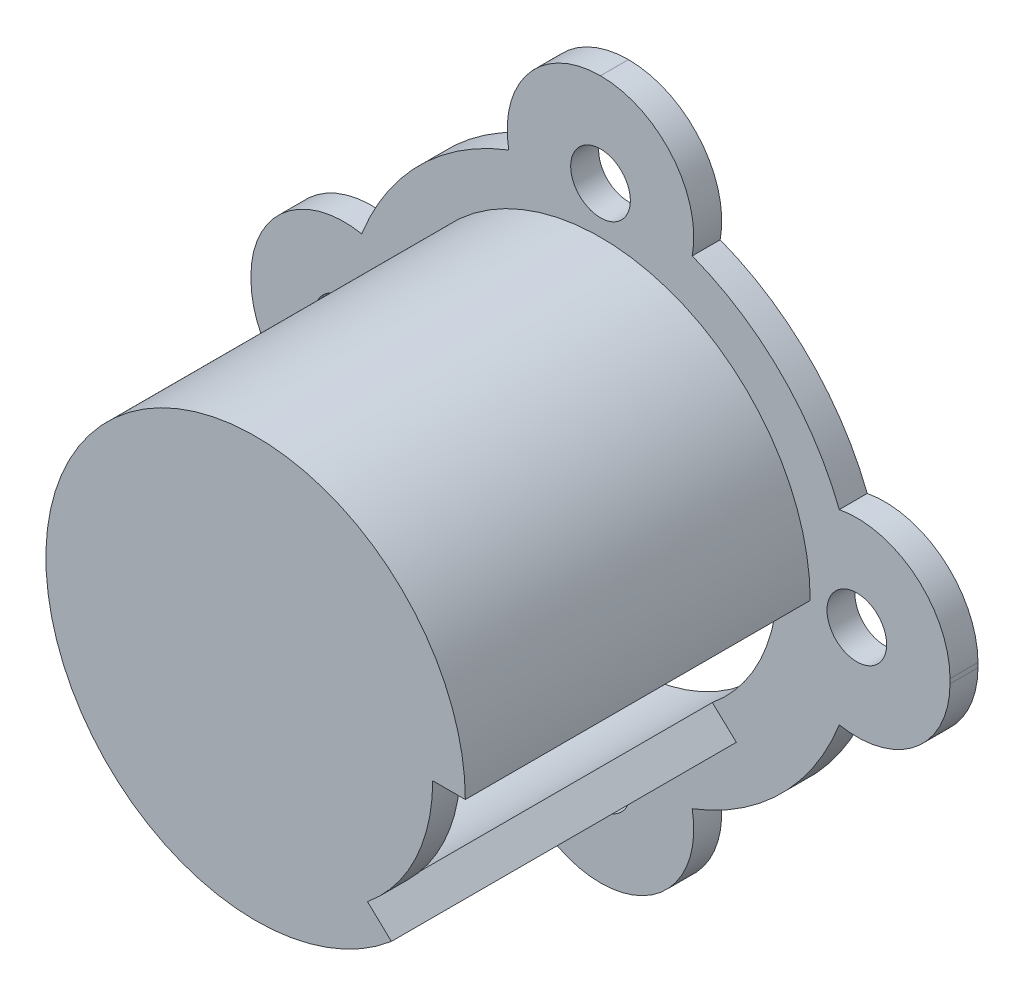
ISO-10303-21;
HEADER;
FILE_DESCRIPTION(('STEP AP214'),'2;1');
FILE_NAME('part.step','',(''),(''),'','','');
FILE_SCHEMA(('AUTOMOTIVE_DESIGN { 1 0 10303 214 1 1 1 1 }'));
ENDSEC;
DATA;
#1=APPLICATION_CONTEXT('core data for automotive mechanical design processes');
#2=APPLICATION_PROTOCOL_DEFINITION('international standard','automotive_design',2000,#1);
#3=PRODUCT_CONTEXT('',#1,'mechanical');
#4=PRODUCT('Part','Part','',(#3));
#5=PRODUCT_RELATED_PRODUCT_CATEGORY('part','',(#4));
#6=PRODUCT_DEFINITION_FORMATION('','',#4);
#7=PRODUCT_DEFINITION_CONTEXT('part definition',#1,'design');
#8=PRODUCT_DEFINITION('design','',#6,#7);
#9=PRODUCT_DEFINITION_SHAPE('','',#8);
#10=(LENGTH_UNIT() NAMED_UNIT(*) SI_UNIT(.MILLI.,.METRE.));
#11=(NAMED_UNIT(*) PLANE_ANGLE_UNIT() SI_UNIT($,.RADIAN.));
#12=(NAMED_UNIT(*) SI_UNIT($,.STERADIAN.) SOLID_ANGLE_UNIT());
#13=UNCERTAINTY_MEASURE_WITH_UNIT(LENGTH_MEASURE(1.E-05),#10,'distance_accuracy_value','');
#14=(GEOMETRIC_REPRESENTATION_CONTEXT(3) GLOBAL_UNCERTAINTY_ASSIGNED_CONTEXT((#13)) GLOBAL_UNIT_ASSIGNED_CONTEXT((#10,
#11,#12)) REPRESENTATION_CONTEXT('',''));
#15=CARTESIAN_POINT('',(0.,0.,0.));
#16=DIRECTION('',(0.,0.,1.));
#17=DIRECTION('',(1.,0.,0.));
#18=AXIS2_PLACEMENT_3D('',#15,#16,#17);
#19=CARTESIAN_POINT('',(0.,0.,-3.));
#20=DIRECTION('',(0.,0.,1.));
#21=DIRECTION('',(1.,0.,0.));
#22=AXIS2_PLACEMENT_3D('',#19,#20,#21);
#23=CYLINDRICAL_SURFACE('',#22,37.5);
#24=CARTESIAN_POINT('',(0.,0.,0.));
#25=DIRECTION('',(0.,0.,-1.));
#26=DIRECTION('',(-1.,0.,0.));
#27=AXIS2_PLACEMENT_3D('',#24,#25,#26);
#28=CIRCLE('',#27,37.5);
#29=CARTESIAN_POINT('',(37.4992082393606,0.243683034019491,0.));
#30=VERTEX_POINT('',#29);
#31=CARTESIAN_POINT('',(37.4992082393606,-0.243683034019488,0.));
#32=VERTEX_POINT('',#31);
#33=EDGE_CURVE('E278',#30,#32,#28,.T.);
#34=ORIENTED_EDGE('',*,*,#33,.T.);
#35=DIRECTION('',(0.,0.,1.));
#36=VECTOR('',#35,1.);
#37=CARTESIAN_POINT('',(37.4992082393606,-0.243683034019488,-3.));
#38=LINE('',#37,#36);
#39=CARTESIAN_POINT('',(37.4992082393606,-0.243683034019488,-3.));
#40=VERTEX_POINT('',#39);
#41=EDGE_CURVE('E11',#32,#40,#38,.F.);
#42=ORIENTED_EDGE('',*,*,#41,.T.);
#43=CARTESIAN_POINT('',(0.,0.,-3.));
#44=DIRECTION('',(0.,0.,-1.));
#45=DIRECTION('',(-1.,0.,0.));
#46=AXIS2_PLACEMENT_3D('',#43,#44,#45);
#47=CIRCLE('',#46,37.5);
#48=CARTESIAN_POINT('',(37.4992082393606,0.243683034019491,-3.));
#49=VERTEX_POINT('',#48);
#50=EDGE_CURVE('E272',#49,#40,#47,.T.);
#51=ORIENTED_EDGE('',*,*,#50,.F.);
#52=DIRECTION('',(0.,0.,1.));
#53=VECTOR('',#52,1.);
#54=CARTESIAN_POINT('',(37.4992082393606,0.243683034019491,-3.));
#55=LINE('',#54,#53);
#56=EDGE_CURVE('E341',#49,#30,#55,.T.);
#57=ORIENTED_EDGE('',*,*,#56,.T.);
#58=EDGE_LOOP('',(#34,#42,#51,#57));
#59=FACE_BOUND('',#58,.T.);
#60=ADVANCED_FACE('F35',(#59),#23,.T.);
#61=CARTESIAN_POINT('',(0.,0.,0.));
#62=DIRECTION('',(0.,0.,-1.));
#63=DIRECTION('',(-1.,0.,0.));
#64=AXIS2_PLACEMENT_3D('',#61,#62,#63);
#65=PLANE('',#64);
#66=CARTESIAN_POINT('',(0.,27.5,0.));
#67=DIRECTION('',(0.,0.,-1.));
#68=DIRECTION('',(-1.,0.,0.));
#69=AXIS2_PLACEMENT_3D('',#66,#67,#68);
#70=CIRCLE('',#69,3.2);
#71=CARTESIAN_POINT('',(-3.2,27.5,0.));
#72=VERTEX_POINT('',#71);
#73=EDGE_CURVE('E241',#72,#72,#70,.T.);
#74=ORIENTED_EDGE('',*,*,#73,.T.);
#75=EDGE_LOOP('',(#74));
#76=FACE_BOUND('',#75,.T.);
#77=CARTESIAN_POINT('',(-27.5,0.,0.));
#78=DIRECTION('',(0.,0.,-1.));
#79=DIRECTION('',(-1.,0.,0.));
#80=AXIS2_PLACEMENT_3D('',#77,#78,#79);
#81=CIRCLE('',#80,3.2);
#82=CARTESIAN_POINT('',(-30.7,0.,0.));
#83=VERTEX_POINT('',#82);
#84=EDGE_CURVE('E247',#83,#83,#81,.T.);
#85=ORIENTED_EDGE('',*,*,#84,.T.);
#86=EDGE_LOOP('',(#85));
#87=FACE_BOUND('',#86,.T.);
#88=CARTESIAN_POINT('',(0.,-27.5,0.));
#89=DIRECTION('',(0.,0.,-1.));
#90=DIRECTION('',(-1.,0.,0.));
#91=AXIS2_PLACEMENT_3D('',#88,#89,#90);
#92=CIRCLE('',#91,3.2);
#93=CARTESIAN_POINT('',(-3.2,-27.5,0.));
#94=VERTEX_POINT('',#93);
#95=EDGE_CURVE('E253',#94,#94,#92,.T.);
#96=ORIENTED_EDGE('',*,*,#95,.T.);
#97=EDGE_LOOP('',(#96));
#98=FACE_BOUND('',#97,.T.);
#99=CARTESIAN_POINT('',(27.5,0.,0.));
#100=DIRECTION('',(0.,0.,-1.));
#101=DIRECTION('',(-1.,0.,0.));
#102=AXIS2_PLACEMENT_3D('',#99,#100,#101);
#103=CIRCLE('',#102,3.2);
#104=CARTESIAN_POINT('',(24.3,0.,0.));
#105=VERTEX_POINT('',#104);
#106=EDGE_CURVE('E259',#105,#105,#103,.T.);
#107=ORIENTED_EDGE('',*,*,#106,.T.);
#108=EDGE_LOOP('',(#107));
#109=FACE_BOUND('',#108,.T.);
#110=CARTESIAN_POINT('',(0.,0.,0.));
#111=DIRECTION('',(0.,0.,-1.));
#112=DIRECTION('',(-1.,0.,0.));
#113=AXIS2_PLACEMENT_3D('',#110,#111,#112);
#114=CIRCLE('',#113,19.);
#115=CARTESIAN_POINT('',(19.,0.,0.));
#116=VERTEX_POINT('',#115);
#117=CARTESIAN_POINT('',(11.9995781260314,-14.7312635166597,0.));
#118=VERTEX_POINT('',#117);
#119=EDGE_CURVE('E262',#116,#118,#114,.T.);
#120=ORIENTED_EDGE('',*,*,#119,.T.);
#121=DIRECTION('',(-0.729810476252891,0.683649521868865,0.));
#122=VECTOR('',#121,1.);
#123=CARTESIAN_POINT('',(14.5735292742118,-17.1424106966813,0.));
#124=LINE('',#123,#122);
#125=CARTESIAN_POINT('',(14.5735292742118,-17.1424106966813,0.));
#126=VERTEX_POINT('',#125);
#127=EDGE_CURVE('E271',#126,#118,#124,.T.);
#128=ORIENTED_EDGE('',*,*,#127,.F.);
#129=CARTESIAN_POINT('',(0.,0.,0.));
#130=DIRECTION('',(0.,0.,1.));
#131=DIRECTION('',(1.,0.,0.));
#132=AXIS2_PLACEMENT_3D('',#129,#130,#131);
#133=CIRCLE('',#132,22.5);
#134=CARTESIAN_POINT('',(22.5,0.,0.));
#135=VERTEX_POINT('',#134);
#136=EDGE_CURVE('E310',#135,#126,#133,.T.);
#137=ORIENTED_EDGE('',*,*,#136,.F.);
#138=DIRECTION('',(1.,0.,0.));
#139=VECTOR('',#138,1.);
#140=CARTESIAN_POINT('',(22.5,0.,0.));
#141=LINE('',#140,#139);
#142=EDGE_CURVE('E283',#116,#135,#141,.T.);
#143=ORIENTED_EDGE('',*,*,#142,.F.);
#144=EDGE_LOOP('',(#120,#128,#137,#143));
#145=FACE_BOUND('',#144,.T.);
#146=CARTESIAN_POINT('',(0.0101629240828799,-37.4999986228663,0.));
#147=VERTEX_POINT('',#146);
#148=CARTESIAN_POINT('',(-0.0101629240828752,-37.4999986228663,0.));
#149=VERTEX_POINT('',#148);
#150=EDGE_CURVE('E183',#147,#149,#28,.T.);
#151=ORIENTED_EDGE('',*,*,#150,.F.);
#152=CARTESIAN_POINT('',(0.00745281099411195,-27.499998990102,0.));
#153=DIRECTION('',(0.,0.,-1.));
#154=DIRECTION('',(-1.,0.,0.));
#155=AXIS2_PLACEMENT_3D('',#152,#153,#154);
#156=CIRCLE('',#155,10.);
#157=CARTESIAN_POINT('',(9.84028136240149,-25.6791522973165,0.));
#158=VERTEX_POINT('',#157);
#159=EDGE_CURVE('E43',#147,#158,#156,.F.);
#160=ORIENTED_EDGE('',*,*,#159,.T.);
#161=CARTESIAN_POINT('',(0.,0.,0.));
#162=DIRECTION('',(0.,0.,1.));
#163=DIRECTION('',(1.,0.,0.));
#164=AXIS2_PLACEMENT_3D('',#161,#162,#163);
#165=CIRCLE('',#164,27.5);
#166=CARTESIAN_POINT('',(25.617376914899,-10.,0.));
#167=VERTEX_POINT('',#166);
#168=EDGE_CURVE('E181',#158,#167,#165,.T.);
#169=ORIENTED_EDGE('',*,*,#168,.T.);
#170=CARTESIAN_POINT('',(27.4994193755311,-0.178700891614291,0.));
#171=DIRECTION('',(0.,0.,-1.));
#172=DIRECTION('',(-1.,0.,0.));
#173=AXIS2_PLACEMENT_3D('',#170,#171,#172);
#174=CIRCLE('',#173,10.);
#175=EDGE_CURVE('E50',#167,#32,#174,.F.);
#176=ORIENTED_EDGE('',*,*,#175,.T.);
#177=ORIENTED_EDGE('',*,*,#33,.F.);
#178=CARTESIAN_POINT('',(27.4994193755311,0.178700891614293,0.));
#179=DIRECTION('',(0.,0.,-1.));
#180=DIRECTION('',(-1.,0.,0.));
#181=AXIS2_PLACEMENT_3D('',#178,#179,#180);
#182=CIRCLE('',#181,10.);
#183=CARTESIAN_POINT('',(25.617376914899,10.,0.));
#184=VERTEX_POINT('',#183);
#185=EDGE_CURVE('E337',#30,#184,#182,.F.);
#186=ORIENTED_EDGE('',*,*,#185,.T.);
#187=CARTESIAN_POINT('',(0.,0.,0.));
#188=DIRECTION('',(0.,0.,-1.));
#189=DIRECTION('',(1.,0.,0.));
#190=AXIS2_PLACEMENT_3D('',#187,#188,#189);
#191=CIRCLE('',#190,27.5);
#192=CARTESIAN_POINT('',(9.84028136240149,25.6791522973165,0.));
#193=VERTEX_POINT('',#192);
#194=EDGE_CURVE('E215',#193,#184,#191,.T.);
#195=ORIENTED_EDGE('',*,*,#194,.F.);
#196=CARTESIAN_POINT('',(0.00745281099410848,27.499998990102,0.));
#197=DIRECTION('',(0.,0.,-1.));
#198=DIRECTION('',(-1.,0.,0.));
#199=AXIS2_PLACEMENT_3D('',#196,#197,#198);
#200=CIRCLE('',#199,10.);
#201=CARTESIAN_POINT('',(0.0101629240828752,37.4999986228663,0.));
#202=VERTEX_POINT('',#201);
#203=EDGE_CURVE('E339',#193,#202,#200,.F.);
#204=ORIENTED_EDGE('',*,*,#203,.T.);
#205=CARTESIAN_POINT('',(-0.0101629240828799,37.4999986228663,0.));
#206=VERTEX_POINT('',#205);
#207=EDGE_CURVE('E274',#206,#202,#28,.T.);
#208=ORIENTED_EDGE('',*,*,#207,.F.);
#209=CARTESIAN_POINT('',(-0.00745281099411195,27.499998990102,0.));
#210=DIRECTION('',(0.,0.,-1.));
#211=DIRECTION('',(-1.,0.,0.));
#212=AXIS2_PLACEMENT_3D('',#209,#210,#211);
#213=CIRCLE('',#212,10.);
#214=CARTESIAN_POINT('',(-9.84028136240149,25.6791522973165,0.));
#215=VERTEX_POINT('',#214);
#216=EDGE_CURVE('E328',#206,#215,#213,.F.);
#217=ORIENTED_EDGE('',*,*,#216,.T.);
#218=CARTESIAN_POINT('',(0.,0.,0.));
#219=DIRECTION('',(0.,0.,1.));
#220=DIRECTION('',(-1.,0.,0.));
#221=AXIS2_PLACEMENT_3D('',#218,#219,#220);
#222=CIRCLE('',#221,27.5);
#223=CARTESIAN_POINT('',(-25.617376914899,10.,0.));
#224=VERTEX_POINT('',#223);
#225=EDGE_CURVE('E227',#215,#224,#222,.T.);
#226=ORIENTED_EDGE('',*,*,#225,.T.);
#227=CARTESIAN_POINT('',(-27.4994193755311,0.178700891614291,0.));
#228=DIRECTION('',(0.,0.,-1.));
#229=DIRECTION('',(-1.,0.,0.));
#230=AXIS2_PLACEMENT_3D('',#227,#228,#229);
#231=CIRCLE('',#230,10.);
#232=CARTESIAN_POINT('',(-37.4992082393606,0.243683034019488,0.));
#233=VERTEX_POINT('',#232);
#234=EDGE_CURVE('E325',#224,#233,#231,.F.);
#235=ORIENTED_EDGE('',*,*,#234,.T.);
#236=CARTESIAN_POINT('',(-37.4992082393606,-0.243683034019491,0.));
#237=VERTEX_POINT('',#236);
#238=EDGE_CURVE('E266',#237,#233,#28,.T.);
#239=ORIENTED_EDGE('',*,*,#238,.F.);
#240=CARTESIAN_POINT('',(-27.4994193755311,-0.178700891614293,0.));
#241=DIRECTION('',(0.,0.,-1.));
#242=DIRECTION('',(-1.,0.,0.));
#243=AXIS2_PLACEMENT_3D('',#240,#241,#242);
#244=CIRCLE('',#243,10.);
#245=CARTESIAN_POINT('',(-25.617376914899,-10.,0.));
#246=VERTEX_POINT('',#245);
#247=EDGE_CURVE('E350',#237,#246,#244,.F.);
#248=ORIENTED_EDGE('',*,*,#247,.T.);
#249=CARTESIAN_POINT('',(0.,0.,0.));
#250=DIRECTION('',(0.,0.,-1.));
#251=DIRECTION('',(-1.,0.,0.));
#252=AXIS2_PLACEMENT_3D('',#249,#250,#251);
#253=CIRCLE('',#252,27.5);
#254=CARTESIAN_POINT('',(-9.84028136240149,-25.6791522973165,0.));
#255=VERTEX_POINT('',#254);
#256=EDGE_CURVE('E203',#255,#246,#253,.T.);
#257=ORIENTED_EDGE('',*,*,#256,.F.);
#258=CARTESIAN_POINT('',(-0.00745281099410848,-27.499998990102,0.));
#259=DIRECTION('',(0.,0.,-1.));
#260=DIRECTION('',(-1.,0.,0.));
#261=AXIS2_PLACEMENT_3D('',#258,#259,#260);
#262=CIRCLE('',#261,10.);
#263=EDGE_CURVE('E352',#255,#149,#262,.F.);
#264=ORIENTED_EDGE('',*,*,#263,.T.);
#265=EDGE_LOOP('',(#151,#160,#169,#176,#177,#186,#195,#204,#208,#217,#226,#235,#239,#248,#257,#264));
#266=FACE_BOUND('',#265,.T.);
#267=ADVANCED_FACE('F180',(#76,#87,#98,#109,#145,#266),#65,.F.);
#268=CARTESIAN_POINT('',(0.0101629240828799,-37.4999986228663,-3.));
#269=VERTEX_POINT('',#268);
#270=CARTESIAN_POINT('',(-0.0101629240828752,-37.4999986228663,-3.));
#271=VERTEX_POINT('',#270);
#272=EDGE_CURVE('E273',#269,#271,#47,.T.);
#273=ORIENTED_EDGE('',*,*,#272,.F.);
#274=DIRECTION('',(0.,0.,1.));
#275=VECTOR('',#274,1.);
#276=CARTESIAN_POINT('',(0.0101629240828799,-37.4999986228663,-3.));
#277=LINE('',#276,#275);
#278=EDGE_CURVE('E58',#269,#147,#277,.T.);
#279=ORIENTED_EDGE('',*,*,#278,.T.);
#280=ORIENTED_EDGE('',*,*,#150,.T.);
#281=DIRECTION('',(0.,0.,1.));
#282=VECTOR('',#281,1.);
#283=CARTESIAN_POINT('',(-0.0101629240828752,-37.4999986228663,-3.));
#284=LINE('',#283,#282);
#285=EDGE_CURVE('E343',#149,#271,#284,.F.);
#286=ORIENTED_EDGE('',*,*,#285,.T.);
#287=EDGE_LOOP('',(#273,#279,#280,#286));
#288=FACE_BOUND('',#287,.T.);
#289=ADVANCED_FACE('F364',(#288),#23,.T.);
#290=CARTESIAN_POINT('',(-37.4992082393606,-0.243683034019491,-3.));
#291=VERTEX_POINT('',#290);
#292=CARTESIAN_POINT('',(-37.4992082393606,0.243683034019488,-3.));
#293=VERTEX_POINT('',#292);
#294=EDGE_CURVE('E277',#291,#293,#47,.T.);
#295=ORIENTED_EDGE('',*,*,#294,.F.);
#296=DIRECTION('',(0.,0.,1.));
#297=VECTOR('',#296,1.);
#298=CARTESIAN_POINT('',(-37.4992082393606,-0.243683034019491,-3.));
#299=LINE('',#298,#297);
#300=EDGE_CURVE('E354',#291,#237,#299,.T.);
#301=ORIENTED_EDGE('',*,*,#300,.T.);
#302=ORIENTED_EDGE('',*,*,#238,.T.);
#303=DIRECTION('',(0.,0.,1.));
#304=VECTOR('',#303,1.);
#305=CARTESIAN_POINT('',(-37.4992082393606,0.243683034019488,-3.));
#306=LINE('',#305,#304);
#307=EDGE_CURVE('E320',#233,#293,#306,.F.);
#308=ORIENTED_EDGE('',*,*,#307,.T.);
#309=EDGE_LOOP('',(#295,#301,#302,#308));
#310=FACE_BOUND('',#309,.T.);
#311=ADVANCED_FACE('F376',(#310),#23,.T.);
#312=CARTESIAN_POINT('',(0.,0.,-3.));
#313=DIRECTION('',(0.,0.,-1.));
#314=DIRECTION('',(-1.,0.,0.));
#315=AXIS2_PLACEMENT_3D('',#312,#313,#314);
#316=PLANE('',#315);
#317=CARTESIAN_POINT('',(0.,0.,-3.));
#318=DIRECTION('',(0.,0.,1.));
#319=DIRECTION('',(1.,0.,0.));
#320=AXIS2_PLACEMENT_3D('',#317,#318,#319);
#321=CIRCLE('',#320,27.5);
#322=CARTESIAN_POINT('',(9.84028136240149,-25.6791522973165,-3.));
#323=VERTEX_POINT('',#322);
#324=CARTESIAN_POINT('',(25.617376914899,-10.,-3.));
#325=VERTEX_POINT('',#324);
#326=EDGE_CURVE('E194',#323,#325,#321,.T.);
#327=ORIENTED_EDGE('',*,*,#326,.F.);
#328=CARTESIAN_POINT('',(0.00745281099411195,-27.499998990102,-3.));
#329=DIRECTION('',(0.,0.,-1.));
#330=DIRECTION('',(-1.,0.,0.));
#331=AXIS2_PLACEMENT_3D('',#328,#329,#330);
#332=CIRCLE('',#331,10.);
#333=EDGE_CURVE('E197',#323,#269,#332,.T.);
#334=ORIENTED_EDGE('',*,*,#333,.T.);
#335=ORIENTED_EDGE('',*,*,#272,.T.);
#336=CARTESIAN_POINT('',(-0.00745281099410848,-27.499998990102,-3.));
#337=DIRECTION('',(0.,0.,-1.));
#338=DIRECTION('',(-1.,0.,0.));
#339=AXIS2_PLACEMENT_3D('',#336,#337,#338);
#340=CIRCLE('',#339,10.);
#341=CARTESIAN_POINT('',(-9.84028136240149,-25.6791522973165,-3.));
#342=VERTEX_POINT('',#341);
#343=EDGE_CURVE('E348',#271,#342,#340,.T.);
#344=ORIENTED_EDGE('',*,*,#343,.T.);
#345=CARTESIAN_POINT('',(0.,0.,-3.));
#346=DIRECTION('',(0.,0.,-1.));
#347=DIRECTION('',(-1.,0.,0.));
#348=AXIS2_PLACEMENT_3D('',#345,#346,#347);
#349=CIRCLE('',#348,27.5);
#350=CARTESIAN_POINT('',(-25.617376914899,-10.,-3.));
#351=VERTEX_POINT('',#350);
#352=EDGE_CURVE('E199',#342,#351,#349,.T.);
#353=ORIENTED_EDGE('',*,*,#352,.T.);
#354=CARTESIAN_POINT('',(-27.4994193755311,-0.178700891614293,-3.));
#355=DIRECTION('',(0.,0.,-1.));
#356=DIRECTION('',(-1.,0.,0.));
#357=AXIS2_PLACEMENT_3D('',#354,#355,#356);
#358=CIRCLE('',#357,10.);
#359=EDGE_CURVE('E346',#351,#291,#358,.T.);
#360=ORIENTED_EDGE('',*,*,#359,.T.);
#361=ORIENTED_EDGE('',*,*,#294,.T.);
#362=CARTESIAN_POINT('',(-27.4994193755311,0.178700891614291,-3.));
#363=DIRECTION('',(0.,0.,-1.));
#364=DIRECTION('',(-1.,0.,0.));
#365=AXIS2_PLACEMENT_3D('',#362,#363,#364);
#366=CIRCLE('',#365,10.);
#367=CARTESIAN_POINT('',(-25.617376914899,10.,-3.));
#368=VERTEX_POINT('',#367);
#369=EDGE_CURVE('E314',#293,#368,#366,.T.);
#370=ORIENTED_EDGE('',*,*,#369,.T.);
#371=CARTESIAN_POINT('',(0.,0.,-3.));
#372=DIRECTION('',(0.,0.,1.));
#373=DIRECTION('',(-1.,0.,0.));
#374=AXIS2_PLACEMENT_3D('',#371,#372,#373);
#375=CIRCLE('',#374,27.5);
#376=CARTESIAN_POINT('',(-9.84028136240149,25.6791522973165,-3.));
#377=VERTEX_POINT('',#376);
#378=EDGE_CURVE('E224',#377,#368,#375,.T.);
#379=ORIENTED_EDGE('',*,*,#378,.F.);
#380=CARTESIAN_POINT('',(-0.00745281099411195,27.499998990102,-3.));
#381=DIRECTION('',(0.,0.,-1.));
#382=DIRECTION('',(-1.,0.,0.));
#383=AXIS2_PLACEMENT_3D('',#380,#381,#382);
#384=CIRCLE('',#383,10.);
#385=CARTESIAN_POINT('',(-0.0101629240828799,37.4999986228663,-3.));
#386=VERTEX_POINT('',#385);
#387=EDGE_CURVE('E318',#377,#386,#384,.T.);
#388=ORIENTED_EDGE('',*,*,#387,.T.);
#389=CARTESIAN_POINT('',(0.0101629240828752,37.4999986228663,-3.));
#390=VERTEX_POINT('',#389);
#391=EDGE_CURVE('E268',#386,#390,#47,.T.);
#392=ORIENTED_EDGE('',*,*,#391,.T.);
#393=CARTESIAN_POINT('',(0.00745281099410848,27.499998990102,-3.));
#394=DIRECTION('',(0.,0.,-1.));
#395=DIRECTION('',(-1.,0.,0.));
#396=AXIS2_PLACEMENT_3D('',#393,#394,#395);
#397=CIRCLE('',#396,10.);
#398=CARTESIAN_POINT('',(9.84028136240149,25.6791522973165,-3.));
#399=VERTEX_POINT('',#398);
#400=EDGE_CURVE('E335',#390,#399,#397,.T.);
#401=ORIENTED_EDGE('',*,*,#400,.T.);
#402=CARTESIAN_POINT('',(0.,0.,-3.));
#403=DIRECTION('',(0.,0.,-1.));
#404=DIRECTION('',(1.,0.,0.));
#405=AXIS2_PLACEMENT_3D('',#402,#403,#404);
#406=CIRCLE('',#405,27.5);
#407=CARTESIAN_POINT('',(25.617376914899,10.,-3.));
#408=VERTEX_POINT('',#407);
#409=EDGE_CURVE('E212',#399,#408,#406,.T.);
#410=ORIENTED_EDGE('',*,*,#409,.T.);
#411=CARTESIAN_POINT('',(27.4994193755311,0.178700891614293,-3.));
#412=DIRECTION('',(0.,0.,-1.));
#413=DIRECTION('',(-1.,0.,0.));
#414=AXIS2_PLACEMENT_3D('',#411,#412,#413);
#415=CIRCLE('',#414,10.);
#416=EDGE_CURVE('E333',#408,#49,#415,.T.);
#417=ORIENTED_EDGE('',*,*,#416,.T.);
#418=ORIENTED_EDGE('',*,*,#50,.T.);
#419=CARTESIAN_POINT('',(27.4994193755311,-0.178700891614291,-3.));
#420=DIRECTION('',(0.,0.,-1.));
#421=DIRECTION('',(-1.,0.,0.));
#422=AXIS2_PLACEMENT_3D('',#419,#420,#421);
#423=CIRCLE('',#422,10.);
#424=EDGE_CURVE('E356',#40,#325,#423,.T.);
#425=ORIENTED_EDGE('',*,*,#424,.T.);
#426=EDGE_LOOP('',(#327,#334,#335,#344,#353,#360,#361,#370,#379,#388,#392,#401,#410,#417,#418,#425));
#427=FACE_BOUND('',#426,.T.);
#428=CARTESIAN_POINT('',(0.,27.5,-3.));
#429=DIRECTION('',(0.,0.,-1.));
#430=DIRECTION('',(-1.,0.,0.));
#431=AXIS2_PLACEMENT_3D('',#428,#429,#430);
#432=CIRCLE('',#431,3.2);
#433=CARTESIAN_POINT('',(-3.2,27.5,-3.));
#434=VERTEX_POINT('',#433);
#435=EDGE_CURVE('E236',#434,#434,#432,.T.);
#436=ORIENTED_EDGE('',*,*,#435,.F.);
#437=EDGE_LOOP('',(#436));
#438=FACE_BOUND('',#437,.T.);
#439=CARTESIAN_POINT('',(-27.5,0.,-3.));
#440=DIRECTION('',(0.,0.,-1.));
#441=DIRECTION('',(-1.,0.,0.));
#442=AXIS2_PLACEMENT_3D('',#439,#440,#441);
#443=CIRCLE('',#442,3.2);
#444=CARTESIAN_POINT('',(-30.7,0.,-3.));
#445=VERTEX_POINT('',#444);
#446=EDGE_CURVE('E244',#445,#445,#443,.T.);
#447=ORIENTED_EDGE('',*,*,#446,.F.);
#448=EDGE_LOOP('',(#447));
#449=FACE_BOUND('',#448,.T.);
#450=CARTESIAN_POINT('',(0.,-27.5,-3.));
#451=DIRECTION('',(0.,0.,-1.));
#452=DIRECTION('',(-1.,0.,0.));
#453=AXIS2_PLACEMENT_3D('',#450,#451,#452);
#454=CIRCLE('',#453,3.2);
#455=CARTESIAN_POINT('',(-3.2,-27.5,-3.));
#456=VERTEX_POINT('',#455);
#457=EDGE_CURVE('E250',#456,#456,#454,.T.);
#458=ORIENTED_EDGE('',*,*,#457,.F.);
#459=EDGE_LOOP('',(#458));
#460=FACE_BOUND('',#459,.T.);
#461=CARTESIAN_POINT('',(27.5,0.,-3.));
#462=DIRECTION('',(0.,0.,-1.));
#463=DIRECTION('',(-1.,0.,0.));
#464=AXIS2_PLACEMENT_3D('',#461,#462,#463);
#465=CIRCLE('',#464,3.2);
#466=CARTESIAN_POINT('',(24.3,0.,-3.));
#467=VERTEX_POINT('',#466);
#468=EDGE_CURVE('E256',#467,#467,#465,.T.);
#469=ORIENTED_EDGE('',*,*,#468,.F.);
#470=EDGE_LOOP('',(#469));
#471=FACE_BOUND('',#470,.T.);
#472=CARTESIAN_POINT('',(0.,0.,-3.));
#473=DIRECTION('',(0.,0.,-1.));
#474=DIRECTION('',(-1.,0.,0.));
#475=AXIS2_PLACEMENT_3D('',#472,#473,#474);
#476=CIRCLE('',#475,19.);
#477=CARTESIAN_POINT('',(-19.,0.,-3.));
#478=VERTEX_POINT('',#477);
#479=EDGE_CURVE('E263',#478,#478,#476,.T.);
#480=ORIENTED_EDGE('',*,*,#479,.F.);
#481=EDGE_LOOP('',(#480));
#482=FACE_BOUND('',#481,.T.);
#483=ADVANCED_FACE('F361',(#427,#438,#449,#460,#471,#482),#316,.T.);
#484=ORIENTED_EDGE('',*,*,#207,.T.);
#485=DIRECTION('',(0.,0.,1.));
#486=VECTOR('',#485,1.);
#487=CARTESIAN_POINT('',(0.0101629240828752,37.4999986228663,-3.));
#488=LINE('',#487,#486);
#489=EDGE_CURVE('E330',#202,#390,#488,.F.);
#490=ORIENTED_EDGE('',*,*,#489,.T.);
#491=ORIENTED_EDGE('',*,*,#391,.F.);
#492=DIRECTION('',(0.,0.,1.));
#493=VECTOR('',#492,1.);
#494=CARTESIAN_POINT('',(-0.0101629240828799,37.4999986228663,-3.));
#495=LINE('',#494,#493);
#496=EDGE_CURVE('E323',#386,#206,#495,.T.);
#497=ORIENTED_EDGE('',*,*,#496,.T.);
#498=EDGE_LOOP('',(#484,#490,#491,#497));
#499=FACE_BOUND('',#498,.T.);
#500=ADVANCED_FACE('F390',(#499),#23,.T.);
#501=CARTESIAN_POINT('',(0.,0.,37.));
#502=DIRECTION('',(0.,0.,-1.));
#503=DIRECTION('',(-1.,0.,0.));
#504=AXIS2_PLACEMENT_3D('',#501,#502,#503);
#505=CYLINDRICAL_SURFACE('',#504,22.5);
#506=CARTESIAN_POINT('',(0.,0.,37.));
#507=DIRECTION('',(0.,0.,1.));
#508=DIRECTION('',(1.,0.,0.));
#509=AXIS2_PLACEMENT_3D('',#506,#507,#508);
#510=CIRCLE('',#509,22.5);
#511=CARTESIAN_POINT('',(22.5,0.,37.));
#512=VERTEX_POINT('',#511);
#513=CARTESIAN_POINT('',(14.5735292742118,-17.1424106966813,37.));
#514=VERTEX_POINT('',#513);
#515=EDGE_CURVE('E311',#512,#514,#510,.T.);
#516=ORIENTED_EDGE('',*,*,#515,.F.);
#517=DIRECTION('',(0.,0.,-1.));
#518=VECTOR('',#517,1.);
#519=CARTESIAN_POINT('',(22.5,0.,37.));
#520=LINE('',#519,#518);
#521=EDGE_CURVE('E294',#512,#135,#520,.T.);
#522=ORIENTED_EDGE('',*,*,#521,.T.);
#523=ORIENTED_EDGE('',*,*,#136,.T.);
#524=DIRECTION('',(0.,0.,-1.));
#525=VECTOR('',#524,1.);
#526=CARTESIAN_POINT('',(14.5735292742118,-17.1424106966813,37.));
#527=LINE('',#526,#525);
#528=EDGE_CURVE('E289',#514,#126,#527,.T.);
#529=ORIENTED_EDGE('',*,*,#528,.F.);
#530=EDGE_LOOP('',(#516,#522,#523,#529));
#531=FACE_BOUND('',#530,.T.);
#532=ADVANCED_FACE('F422',(#531),#505,.T.);
#533=CARTESIAN_POINT('',(0.,0.,37.));
#534=DIRECTION('',(0.,0.,1.));
#535=DIRECTION('',(1.,0.,0.));
#536=AXIS2_PLACEMENT_3D('',#533,#534,#535);
#537=PLANE('',#536);
#538=DIRECTION('',(1.,0.,0.));
#539=VECTOR('',#538,1.);
#540=CARTESIAN_POINT('',(22.5,0.,37.));
#541=LINE('',#540,#539);
#542=CARTESIAN_POINT('',(19.,0.,37.));
#543=VERTEX_POINT('',#542);
#544=EDGE_CURVE('E286',#543,#512,#541,.T.);
#545=ORIENTED_EDGE('',*,*,#544,.T.);
#546=ORIENTED_EDGE('',*,*,#515,.T.);
#547=DIRECTION('',(-0.729810476252891,0.683649521868865,0.));
#548=VECTOR('',#547,1.);
#549=CARTESIAN_POINT('',(14.5735292742118,-17.1424106966813,37.));
#550=LINE('',#549,#548);
#551=CARTESIAN_POINT('',(11.9995781260314,-14.7312635166597,37.));
#552=VERTEX_POINT('',#551);
#553=EDGE_CURVE('E279',#514,#552,#550,.T.);
#554=ORIENTED_EDGE('',*,*,#553,.T.);
#555=CARTESIAN_POINT('',(0.,0.,37.));
#556=DIRECTION('',(0.,0.,1.));
#557=DIRECTION('',(1.,0.,0.));
#558=AXIS2_PLACEMENT_3D('',#555,#556,#557);
#559=CIRCLE('',#558,19.);
#560=EDGE_CURVE('E282',#552,#543,#559,.T.);
#561=ORIENTED_EDGE('',*,*,#560,.T.);
#562=EDGE_LOOP('',(#545,#546,#554,#561));
#563=FACE_BOUND('',#562,.T.);
#564=ADVANCED_FACE('F427',(#563),#537,.T.);
#565=CARTESIAN_POINT('',(0.,0.,-3.));
#566=DIRECTION('',(0.,0.,1.));
#567=DIRECTION('',(1.,0.,0.));
#568=AXIS2_PLACEMENT_3D('',#565,#566,#567);
#569=CYLINDRICAL_SURFACE('',#568,19.);
#570=DIRECTION('',(0.,0.,-1.));
#571=VECTOR('',#570,1.);
#572=CARTESIAN_POINT('',(19.,0.,37.));
#573=LINE('',#572,#571);
#574=CARTESIAN_POINT('',(19.,0.,34.));
#575=VERTEX_POINT('',#574);
#576=EDGE_CURVE('E301',#575,#116,#573,.T.);
#577=ORIENTED_EDGE('',*,*,#576,.F.);
#578=CARTESIAN_POINT('',(0.,0.,34.));
#579=DIRECTION('',(0.,0.,-1.));
#580=DIRECTION('',(-1.,0.,0.));
#581=AXIS2_PLACEMENT_3D('',#578,#579,#580);
#582=CIRCLE('',#581,19.);
#583=CARTESIAN_POINT('',(11.9995781260314,-14.7312635166597,34.));
#584=VERTEX_POINT('',#583);
#585=EDGE_CURVE('E297',#584,#575,#582,.T.);
#586=ORIENTED_EDGE('',*,*,#585,.F.);
#587=DIRECTION('',(0.,0.,-1.));
#588=VECTOR('',#587,1.);
#589=CARTESIAN_POINT('',(11.9995781260314,-14.7312635166597,37.));
#590=LINE('',#589,#588);
#591=EDGE_CURVE('E304',#584,#118,#590,.T.);
#592=ORIENTED_EDGE('',*,*,#591,.T.);
#593=ORIENTED_EDGE('',*,*,#119,.F.);
#594=EDGE_LOOP('',(#577,#586,#592,#593));
#595=FACE_BOUND('',#594,.T.);
#596=ORIENTED_EDGE('',*,*,#479,.T.);
#597=EDGE_LOOP('',(#596));
#598=FACE_BOUND('',#597,.T.);
#599=ADVANCED_FACE('F627',(#595,#598),#569,.F.);
#600=CARTESIAN_POINT('',(0.,0.,34.));
#601=DIRECTION('',(0.,0.,-1.));
#602=DIRECTION('',(-1.,0.,0.));
#603=AXIS2_PLACEMENT_3D('',#600,#601,#602);
#604=PLANE('',#603);
#605=EDGE_CURVE('E307',#575,#584,#582,.T.);
#606=ORIENTED_EDGE('',*,*,#605,.T.);
#607=ORIENTED_EDGE('',*,*,#585,.T.);
#608=EDGE_LOOP('',(#606,#607));
#609=FACE_BOUND('',#608,.T.);
#610=ADVANCED_FACE('F620',(#609),#604,.T.);
#611=CARTESIAN_POINT('',(22.5,0.,37.));
#612=DIRECTION('',(0.,1.,0.));
#613=DIRECTION('',(0.,0.,1.));
#614=AXIS2_PLACEMENT_3D('',#611,#612,#613);
#615=PLANE('',#614);
#616=ORIENTED_EDGE('',*,*,#142,.T.);
#617=ORIENTED_EDGE('',*,*,#521,.F.);
#618=ORIENTED_EDGE('',*,*,#544,.F.);
#619=EDGE_CURVE('E298',#543,#575,#573,.T.);
#620=ORIENTED_EDGE('',*,*,#619,.T.);
#621=ORIENTED_EDGE('',*,*,#576,.T.);
#622=EDGE_LOOP('',(#616,#617,#618,#620,#621));
#623=FACE_BOUND('',#622,.T.);
#624=ADVANCED_FACE('F615',(#623),#615,.F.);
#625=CARTESIAN_POINT('',(0.,0.,37.));
#626=DIRECTION('',(0.,0.,-1.));
#627=DIRECTION('',(-1.,0.,0.));
#628=AXIS2_PLACEMENT_3D('',#625,#626,#627);
#629=CYLINDRICAL_SURFACE('',#628,19.);
#630=ORIENTED_EDGE('',*,*,#605,.F.);
#631=ORIENTED_EDGE('',*,*,#619,.F.);
#632=ORIENTED_EDGE('',*,*,#560,.F.);
#633=EDGE_CURVE('E302',#552,#584,#590,.T.);
#634=ORIENTED_EDGE('',*,*,#633,.T.);
#635=EDGE_LOOP('',(#630,#631,#632,#634));
#636=FACE_BOUND('',#635,.T.);
#637=ADVANCED_FACE('F607',(#636),#629,.T.);
#638=CARTESIAN_POINT('',(14.5735292742118,-17.1424106966813,37.));
#639=DIRECTION('',(-0.683649521868865,-0.729810476252891,0.));
#640=DIRECTION('',(0.729810476252891,-0.683649521868865,0.));
#641=AXIS2_PLACEMENT_3D('',#638,#639,#640);
#642=PLANE('',#641);
#643=ORIENTED_EDGE('',*,*,#127,.T.);
#644=ORIENTED_EDGE('',*,*,#591,.F.);
#645=ORIENTED_EDGE('',*,*,#633,.F.);
#646=ORIENTED_EDGE('',*,*,#553,.F.);
#647=ORIENTED_EDGE('',*,*,#528,.T.);
#648=EDGE_LOOP('',(#643,#644,#645,#646,#647));
#649=FACE_BOUND('',#648,.T.);
#650=ADVANCED_FACE('F596',(#649),#642,.F.);
#651=CARTESIAN_POINT('',(27.5,0.,-3.));
#652=DIRECTION('',(0.,0.,-1.));
#653=DIRECTION('',(-1.,0.,0.));
#654=AXIS2_PLACEMENT_3D('',#651,#652,#653);
#655=CYLINDRICAL_SURFACE('',#654,3.2);
#656=ORIENTED_EDGE('',*,*,#106,.F.);
#657=EDGE_LOOP('',(#656));
#658=FACE_BOUND('',#657,.T.);
#659=ORIENTED_EDGE('',*,*,#468,.T.);
#660=EDGE_LOOP('',(#659));
#661=FACE_BOUND('',#660,.T.);
#662=ADVANCED_FACE('F586',(#658,#661),#655,.F.);
#663=CARTESIAN_POINT('',(0.,-27.5,-3.));
#664=DIRECTION('',(0.,0.,-1.));
#665=DIRECTION('',(-1.,0.,0.));
#666=AXIS2_PLACEMENT_3D('',#663,#664,#665);
#667=CYLINDRICAL_SURFACE('',#666,3.2);
#668=ORIENTED_EDGE('',*,*,#95,.F.);
#669=EDGE_LOOP('',(#668));
#670=FACE_BOUND('',#669,.T.);
#671=ORIENTED_EDGE('',*,*,#457,.T.);
#672=EDGE_LOOP('',(#671));
#673=FACE_BOUND('',#672,.T.);
#674=ADVANCED_FACE('F576',(#670,#673),#667,.F.);
#675=CARTESIAN_POINT('',(-27.5,0.,-3.));
#676=DIRECTION('',(0.,0.,-1.));
#677=DIRECTION('',(-1.,0.,0.));
#678=AXIS2_PLACEMENT_3D('',#675,#676,#677);
#679=CYLINDRICAL_SURFACE('',#678,3.2);
#680=ORIENTED_EDGE('',*,*,#84,.F.);
#681=EDGE_LOOP('',(#680));
#682=FACE_BOUND('',#681,.T.);
#683=ORIENTED_EDGE('',*,*,#446,.T.);
#684=EDGE_LOOP('',(#683));
#685=FACE_BOUND('',#684,.T.);
#686=ADVANCED_FACE('F566',(#682,#685),#679,.F.);
#687=CARTESIAN_POINT('',(0.,27.5,-3.));
#688=DIRECTION('',(0.,0.,-1.));
#689=DIRECTION('',(-1.,0.,0.));
#690=AXIS2_PLACEMENT_3D('',#687,#688,#689);
#691=CYLINDRICAL_SURFACE('',#690,3.2);
#692=ORIENTED_EDGE('',*,*,#73,.F.);
#693=EDGE_LOOP('',(#692));
#694=FACE_BOUND('',#693,.T.);
#695=ORIENTED_EDGE('',*,*,#435,.T.);
#696=EDGE_LOOP('',(#695));
#697=FACE_BOUND('',#696,.T.);
#698=ADVANCED_FACE('F557',(#694,#697),#691,.F.);
#699=CARTESIAN_POINT('',(0.,0.,0.));
#700=DIRECTION('',(0.,0.,-1.));
#701=DIRECTION('',(-1.,0.,0.));
#702=AXIS2_PLACEMENT_3D('',#699,#700,#701);
#703=CYLINDRICAL_SURFACE('',#702,27.5);
#704=ORIENTED_EDGE('',*,*,#378,.T.);
#705=DIRECTION('',(0.,0.,-1.));
#706=VECTOR('',#705,1.);
#707=CARTESIAN_POINT('',(-25.617376914899,10.,0.));
#708=LINE('',#707,#706);
#709=EDGE_CURVE('E233',#224,#368,#708,.T.);
#710=ORIENTED_EDGE('',*,*,#709,.F.);
#711=ORIENTED_EDGE('',*,*,#225,.F.);
#712=DIRECTION('',(0.,0.,-1.));
#713=VECTOR('',#712,1.);
#714=CARTESIAN_POINT('',(-9.84028136240149,25.6791522973165,0.));
#715=LINE('',#714,#713);
#716=EDGE_CURVE('E230',#215,#377,#715,.T.);
#717=ORIENTED_EDGE('',*,*,#716,.T.);
#718=EDGE_LOOP('',(#704,#710,#711,#717));
#719=FACE_BOUND('',#718,.T.);
#720=ADVANCED_FACE('F384',(#719),#703,.T.);
#721=CARTESIAN_POINT('',(-0.00745281099411195,27.499998990102,-3.));
#722=DIRECTION('',(0.,0.,1.));
#723=DIRECTION('',(1.,0.,0.));
#724=AXIS2_PLACEMENT_3D('',#721,#722,#723);
#725=CYLINDRICAL_SURFACE('',#724,10.);
#726=ORIENTED_EDGE('',*,*,#216,.F.);
#727=ORIENTED_EDGE('',*,*,#496,.F.);
#728=ORIENTED_EDGE('',*,*,#387,.F.);
#729=ORIENTED_EDGE('',*,*,#716,.F.);
#730=EDGE_LOOP('',(#726,#727,#728,#729));
#731=FACE_BOUND('',#730,.T.);
#732=ADVANCED_FACE('F386',(#731),#725,.T.);
#733=CARTESIAN_POINT('',(-27.4994193755311,0.178700891614291,0.));
#734=DIRECTION('',(0.,0.,1.));
#735=DIRECTION('',(1.,0.,0.));
#736=AXIS2_PLACEMENT_3D('',#733,#734,#735);
#737=CYLINDRICAL_SURFACE('',#736,10.);
#738=ORIENTED_EDGE('',*,*,#234,.F.);
#739=ORIENTED_EDGE('',*,*,#709,.T.);
#740=ORIENTED_EDGE('',*,*,#369,.F.);
#741=ORIENTED_EDGE('',*,*,#307,.F.);
#742=EDGE_LOOP('',(#738,#739,#740,#741));
#743=FACE_BOUND('',#742,.T.);
#744=ADVANCED_FACE('F375',(#743),#737,.T.);
#745=CARTESIAN_POINT('',(0.,0.,0.));
#746=DIRECTION('',(0.,0.,-1.));
#747=DIRECTION('',(-1.,0.,0.));
#748=AXIS2_PLACEMENT_3D('',#745,#746,#747);
#749=CYLINDRICAL_SURFACE('',#748,27.5);
#750=ORIENTED_EDGE('',*,*,#409,.F.);
#751=DIRECTION('',(0.,0.,-1.));
#752=VECTOR('',#751,1.);
#753=CARTESIAN_POINT('',(9.84028136240149,25.6791522973165,0.));
#754=LINE('',#753,#752);
#755=EDGE_CURVE('E221',#193,#399,#754,.T.);
#756=ORIENTED_EDGE('',*,*,#755,.F.);
#757=ORIENTED_EDGE('',*,*,#194,.T.);
#758=DIRECTION('',(0.,0.,-1.));
#759=VECTOR('',#758,1.);
#760=CARTESIAN_POINT('',(25.617376914899,10.,0.));
#761=LINE('',#760,#759);
#762=EDGE_CURVE('E218',#184,#408,#761,.T.);
#763=ORIENTED_EDGE('',*,*,#762,.T.);
#764=EDGE_LOOP('',(#750,#756,#757,#763));
#765=FACE_BOUND('',#764,.T.);
#766=ADVANCED_FACE('F397',(#765),#749,.T.);
#767=CARTESIAN_POINT('',(0.00745281099410848,27.499998990102,0.));
#768=DIRECTION('',(0.,0.,1.));
#769=DIRECTION('',(1.,0.,0.));
#770=AXIS2_PLACEMENT_3D('',#767,#768,#769);
#771=CYLINDRICAL_SURFACE('',#770,10.);
#772=ORIENTED_EDGE('',*,*,#203,.F.);
#773=ORIENTED_EDGE('',*,*,#755,.T.);
#774=ORIENTED_EDGE('',*,*,#400,.F.);
#775=ORIENTED_EDGE('',*,*,#489,.F.);
#776=EDGE_LOOP('',(#772,#773,#774,#775));
#777=FACE_BOUND('',#776,.T.);
#778=ADVANCED_FACE('F394',(#777),#771,.T.);
#779=CARTESIAN_POINT('',(27.4994193755311,0.178700891614293,-3.));
#780=DIRECTION('',(0.,0.,1.));
#781=DIRECTION('',(1.,0.,0.));
#782=AXIS2_PLACEMENT_3D('',#779,#780,#781);
#783=CYLINDRICAL_SURFACE('',#782,10.);
#784=ORIENTED_EDGE('',*,*,#185,.F.);
#785=ORIENTED_EDGE('',*,*,#56,.F.);
#786=ORIENTED_EDGE('',*,*,#416,.F.);
#787=ORIENTED_EDGE('',*,*,#762,.F.);
#788=EDGE_LOOP('',(#784,#785,#786,#787));
#789=FACE_BOUND('',#788,.T.);
#790=ADVANCED_FACE('F402',(#789),#783,.T.);
#791=CARTESIAN_POINT('',(0.,0.,0.));
#792=DIRECTION('',(0.,0.,-1.));
#793=DIRECTION('',(-1.,0.,0.));
#794=AXIS2_PLACEMENT_3D('',#791,#792,#793);
#795=CYLINDRICAL_SURFACE('',#794,27.5);
#796=ORIENTED_EDGE('',*,*,#352,.F.);
#797=DIRECTION('',(0.,0.,-1.));
#798=VECTOR('',#797,1.);
#799=CARTESIAN_POINT('',(-9.84028136240149,-25.6791522973165,0.));
#800=LINE('',#799,#798);
#801=EDGE_CURVE('E209',#255,#342,#800,.T.);
#802=ORIENTED_EDGE('',*,*,#801,.F.);
#803=ORIENTED_EDGE('',*,*,#256,.T.);
#804=DIRECTION('',(0.,0.,-1.));
#805=VECTOR('',#804,1.);
#806=CARTESIAN_POINT('',(-25.617376914899,-10.,0.));
#807=LINE('',#806,#805);
#808=EDGE_CURVE('E206',#246,#351,#807,.T.);
#809=ORIENTED_EDGE('',*,*,#808,.T.);
#810=EDGE_LOOP('',(#796,#802,#803,#809));
#811=FACE_BOUND('',#810,.T.);
#812=ADVANCED_FACE('F446',(#811),#795,.T.);
#813=CARTESIAN_POINT('',(-0.00745281099410848,-27.499998990102,0.));
#814=DIRECTION('',(0.,0.,1.));
#815=DIRECTION('',(1.,0.,0.));
#816=AXIS2_PLACEMENT_3D('',#813,#814,#815);
#817=CYLINDRICAL_SURFACE('',#816,10.);
#818=ORIENTED_EDGE('',*,*,#263,.F.);
#819=ORIENTED_EDGE('',*,*,#801,.T.);
#820=ORIENTED_EDGE('',*,*,#343,.F.);
#821=ORIENTED_EDGE('',*,*,#285,.F.);
#822=EDGE_LOOP('',(#818,#819,#820,#821));
#823=FACE_BOUND('',#822,.T.);
#824=ADVANCED_FACE('F451',(#823),#817,.T.);
#825=CARTESIAN_POINT('',(-27.4994193755311,-0.178700891614293,-3.));
#826=DIRECTION('',(0.,0.,1.));
#827=DIRECTION('',(1.,0.,0.));
#828=AXIS2_PLACEMENT_3D('',#825,#826,#827);
#829=CYLINDRICAL_SURFACE('',#828,10.);
#830=ORIENTED_EDGE('',*,*,#247,.F.);
#831=ORIENTED_EDGE('',*,*,#300,.F.);
#832=ORIENTED_EDGE('',*,*,#359,.F.);
#833=ORIENTED_EDGE('',*,*,#808,.F.);
#834=EDGE_LOOP('',(#830,#831,#832,#833));
#835=FACE_BOUND('',#834,.T.);
#836=ADVANCED_FACE('F463',(#835),#829,.T.);
#837=CARTESIAN_POINT('',(0.,0.,0.));
#838=DIRECTION('',(0.,0.,-1.));
#839=DIRECTION('',(-1.,0.,0.));
#840=AXIS2_PLACEMENT_3D('',#837,#838,#839);
#841=CYLINDRICAL_SURFACE('',#840,27.5);
#842=ORIENTED_EDGE('',*,*,#326,.T.);
#843=DIRECTION('',(0.,0.,-1.));
#844=VECTOR('',#843,1.);
#845=CARTESIAN_POINT('',(25.617376914899,-10.,0.));
#846=LINE('',#845,#844);
#847=EDGE_CURVE('E193',#167,#325,#846,.T.);
#848=ORIENTED_EDGE('',*,*,#847,.F.);
#849=ORIENTED_EDGE('',*,*,#168,.F.);
#850=DIRECTION('',(0.,0.,-1.));
#851=VECTOR('',#850,1.);
#852=CARTESIAN_POINT('',(9.84028136240149,-25.6791522973165,0.));
#853=LINE('',#852,#851);
#854=EDGE_CURVE('E190',#158,#323,#853,.T.);
#855=ORIENTED_EDGE('',*,*,#854,.T.);
#856=EDGE_LOOP('',(#842,#848,#849,#855));
#857=FACE_BOUND('',#856,.T.);
#858=ADVANCED_FACE('F189',(#857),#841,.T.);
#859=CARTESIAN_POINT('',(0.00745281099411195,-27.499998990102,-3.));
#860=DIRECTION('',(0.,0.,1.));
#861=DIRECTION('',(1.,0.,0.));
#862=AXIS2_PLACEMENT_3D('',#859,#860,#861);
#863=CYLINDRICAL_SURFACE('',#862,10.);
#864=ORIENTED_EDGE('',*,*,#159,.F.);
#865=ORIENTED_EDGE('',*,*,#278,.F.);
#866=ORIENTED_EDGE('',*,*,#333,.F.);
#867=ORIENTED_EDGE('',*,*,#854,.F.);
#868=EDGE_LOOP('',(#864,#865,#866,#867));
#869=FACE_BOUND('',#868,.T.);
#870=ADVANCED_FACE('F196',(#869),#863,.T.);
#871=CARTESIAN_POINT('',(27.4994193755311,-0.178700891614291,0.));
#872=DIRECTION('',(0.,0.,1.));
#873=DIRECTION('',(1.,0.,0.));
#874=AXIS2_PLACEMENT_3D('',#871,#872,#873);
#875=CYLINDRICAL_SURFACE('',#874,10.);
#876=ORIENTED_EDGE('',*,*,#175,.F.);
#877=ORIENTED_EDGE('',*,*,#847,.T.);
#878=ORIENTED_EDGE('',*,*,#424,.F.);
#879=ORIENTED_EDGE('',*,*,#41,.F.);
#880=EDGE_LOOP('',(#876,#877,#878,#879));
#881=FACE_BOUND('',#880,.T.);
#882=ADVANCED_FACE('F37',(#881),#875,.T.);
#883=CLOSED_SHELL('',(#60,#267,#289,#311,#483,#500,#532,#564,#599,#610,#624,#637,#650,#662,#674,
#686,#698,#720,#732,#744,#766,#778,#790,#812,#824,#836,#858,#870,#882));
#884=MANIFOLD_SOLID_BREP('B2',#883);
#885=ADVANCED_BREP_SHAPE_REPRESENTATION('',(#18,#884),#14);
#886=SHAPE_DEFINITION_REPRESENTATION(#9,#885);
ENDSEC;
END-ISO-10303-21;
